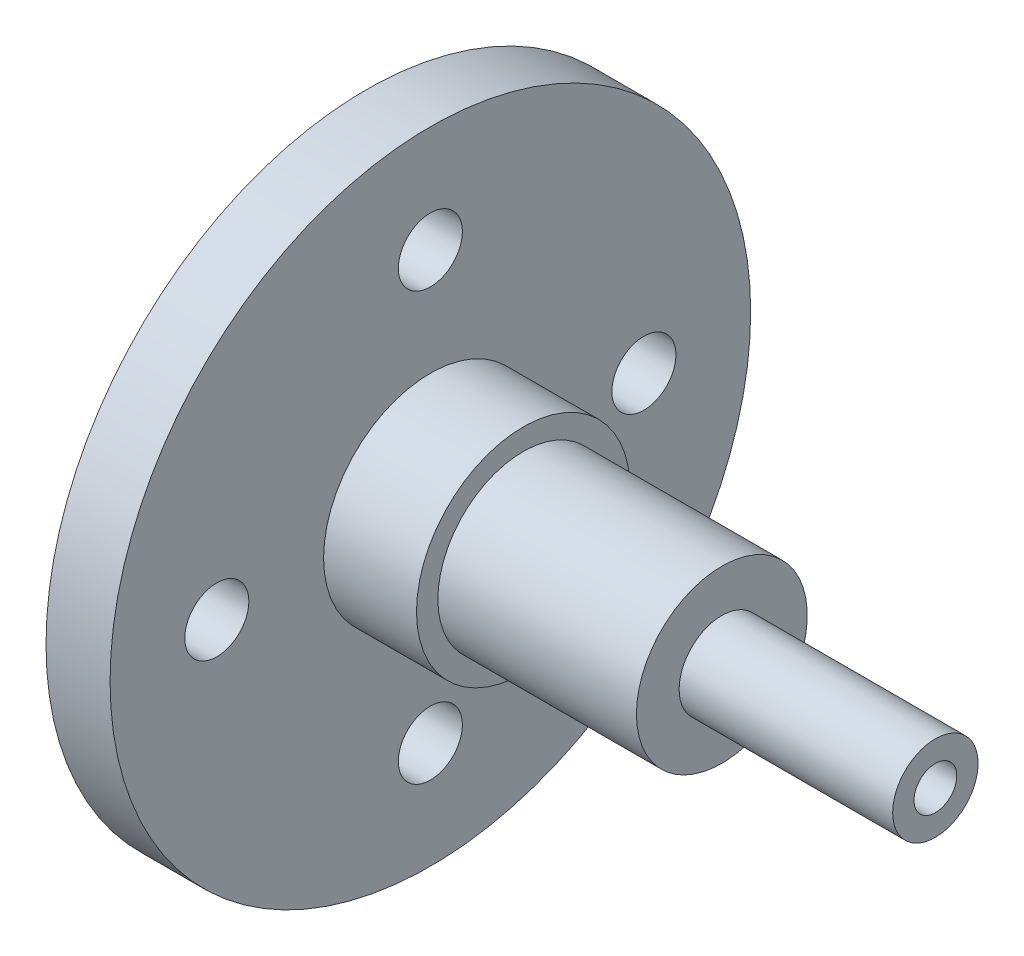
ISO-10303-21;
HEADER;
FILE_DESCRIPTION(('STEP AP214'),'2;1');
FILE_NAME('part.step','',(''),(''),'','','');
FILE_SCHEMA(('AUTOMOTIVE_DESIGN { 1 0 10303 214 1 1 1 1 }'));
ENDSEC;
DATA;
#1=APPLICATION_CONTEXT('core data for automotive mechanical design processes');
#2=APPLICATION_PROTOCOL_DEFINITION('international standard','automotive_design',2000,#1);
#3=PRODUCT_CONTEXT('',#1,'mechanical');
#4=PRODUCT('Part','Part','',(#3));
#5=PRODUCT_RELATED_PRODUCT_CATEGORY('part','',(#4));
#6=PRODUCT_DEFINITION_FORMATION('','',#4);
#7=PRODUCT_DEFINITION_CONTEXT('part definition',#1,'design');
#8=PRODUCT_DEFINITION('design','',#6,#7);
#9=PRODUCT_DEFINITION_SHAPE('','',#8);
#10=(LENGTH_UNIT() NAMED_UNIT(*) SI_UNIT(.MILLI.,.METRE.));
#11=(NAMED_UNIT(*) PLANE_ANGLE_UNIT() SI_UNIT($,.RADIAN.));
#12=(NAMED_UNIT(*) SI_UNIT($,.STERADIAN.) SOLID_ANGLE_UNIT());
#13=UNCERTAINTY_MEASURE_WITH_UNIT(LENGTH_MEASURE(1.E-05),#10,'distance_accuracy_value','');
#14=(GEOMETRIC_REPRESENTATION_CONTEXT(3) GLOBAL_UNCERTAINTY_ASSIGNED_CONTEXT((#13)) GLOBAL_UNIT_ASSIGNED_CONTEXT((#10,
#11,#12)) REPRESENTATION_CONTEXT('',''));
#15=CARTESIAN_POINT('',(0.,0.,0.));
#16=DIRECTION('',(0.,0.,1.));
#17=DIRECTION('',(1.,0.,0.));
#18=AXIS2_PLACEMENT_3D('',#15,#16,#17);
#19=CARTESIAN_POINT('',(-13.325,0.,0.));
#20=DIRECTION('',(-1.,0.,0.));
#21=DIRECTION('',(0.,0.,1.));
#22=AXIS2_PLACEMENT_3D('',#19,#20,#21);
#23=CYLINDRICAL_SURFACE('',#22,15.);
#24=CARTESIAN_POINT('',(-13.325,0.,0.));
#25=DIRECTION('',(-1.,0.,0.));
#26=DIRECTION('',(0.,0.,1.));
#27=AXIS2_PLACEMENT_3D('',#24,#25,#26);
#28=CIRCLE('',#27,15.);
#29=CARTESIAN_POINT('',(-13.325,0.,15.));
#30=VERTEX_POINT('',#29);
#31=EDGE_CURVE('E75',#30,#30,#28,.T.);
#32=ORIENTED_EDGE('',*,*,#31,.F.);
#33=EDGE_LOOP('',(#32));
#34=FACE_BOUND('',#33,.T.);
#35=CARTESIAN_POINT('',(-10.325,0.,0.));
#36=DIRECTION('',(-1.,0.,0.));
#37=DIRECTION('',(0.,0.,1.));
#38=AXIS2_PLACEMENT_3D('',#35,#36,#37);
#39=CIRCLE('',#38,15.);
#40=CARTESIAN_POINT('',(-10.325,0.,15.));
#41=VERTEX_POINT('',#40);
#42=EDGE_CURVE('E10',#41,#41,#39,.T.);
#43=ORIENTED_EDGE('',*,*,#42,.T.);
#44=EDGE_LOOP('',(#43));
#45=FACE_BOUND('',#44,.T.);
#46=ADVANCED_FACE('F41',(#34,#45),#23,.T.);
#47=CARTESIAN_POINT('',(-10.325,15.,0.));
#48=DIRECTION('',(-1.,0.,0.));
#49=DIRECTION('',(0.,0.,1.));
#50=AXIS2_PLACEMENT_3D('',#47,#48,#49);
#51=PLANE('',#50);
#52=CARTESIAN_POINT('',(-10.325,10.,0.));
#53=DIRECTION('',(1.,0.,0.));
#54=DIRECTION('',(0.,0.,-1.));
#55=AXIS2_PLACEMENT_3D('',#52,#53,#54);
#56=CIRCLE('',#55,1.5);
#57=CARTESIAN_POINT('',(-10.325,10.,-1.5));
#58=VERTEX_POINT('',#57);
#59=EDGE_CURVE('E97',#58,#58,#56,.T.);
#60=ORIENTED_EDGE('',*,*,#59,.F.);
#61=EDGE_LOOP('',(#60));
#62=FACE_BOUND('',#61,.T.);
#63=CARTESIAN_POINT('',(-10.325,0.,-10.));
#64=DIRECTION('',(1.,0.,0.));
#65=DIRECTION('',(0.,0.,-1.));
#66=AXIS2_PLACEMENT_3D('',#63,#64,#65);
#67=CIRCLE('',#66,1.5);
#68=CARTESIAN_POINT('',(-10.325,0.,-11.5));
#69=VERTEX_POINT('',#68);
#70=EDGE_CURVE('E94',#69,#69,#67,.T.);
#71=ORIENTED_EDGE('',*,*,#70,.F.);
#72=EDGE_LOOP('',(#71));
#73=FACE_BOUND('',#72,.T.);
#74=CARTESIAN_POINT('',(-10.325,-10.,0.));
#75=DIRECTION('',(1.,0.,0.));
#76=DIRECTION('',(0.,0.,-1.));
#77=AXIS2_PLACEMENT_3D('',#74,#75,#76);
#78=CIRCLE('',#77,1.5);
#79=CARTESIAN_POINT('',(-10.325,-10.,-1.49999999999993));
#80=VERTEX_POINT('',#79);
#81=EDGE_CURVE('E88',#80,#80,#78,.T.);
#82=ORIENTED_EDGE('',*,*,#81,.F.);
#83=EDGE_LOOP('',(#82));
#84=FACE_BOUND('',#83,.T.);
#85=CARTESIAN_POINT('',(-10.325,1.04744440165294E-13,10.));
#86=DIRECTION('',(1.,0.,0.));
#87=DIRECTION('',(0.,0.,-1.));
#88=AXIS2_PLACEMENT_3D('',#85,#86,#87);
#89=CIRCLE('',#88,1.5);
#90=CARTESIAN_POINT('',(-10.325,1.04744440165294E-13,8.5));
#91=VERTEX_POINT('',#90);
#92=EDGE_CURVE('E82',#91,#91,#89,.T.);
#93=ORIENTED_EDGE('',*,*,#92,.F.);
#94=EDGE_LOOP('',(#93));
#95=FACE_BOUND('',#94,.T.);
#96=ORIENTED_EDGE('',*,*,#42,.F.);
#97=EDGE_LOOP('',(#96));
#98=FACE_BOUND('',#97,.T.);
#99=CARTESIAN_POINT('',(-10.325,0.,0.));
#100=DIRECTION('',(-1.,0.,0.));
#101=DIRECTION('',(0.,0.,1.));
#102=AXIS2_PLACEMENT_3D('',#99,#100,#101);
#103=CIRCLE('',#102,5.);
#104=CARTESIAN_POINT('',(-10.325,0.,5.));
#105=VERTEX_POINT('',#104);
#106=EDGE_CURVE('E47',#105,#105,#103,.T.);
#107=ORIENTED_EDGE('',*,*,#106,.T.);
#108=EDGE_LOOP('',(#107));
#109=FACE_BOUND('',#108,.T.);
#110=ADVANCED_FACE('F113',(#62,#73,#84,#95,#98,#109),#51,.F.);
#111=CARTESIAN_POINT('',(-13.325,0.,0.));
#112=DIRECTION('',(-1.,0.,0.));
#113=DIRECTION('',(0.,0.,1.));
#114=AXIS2_PLACEMENT_3D('',#111,#112,#113);
#115=CYLINDRICAL_SURFACE('',#114,5.);
#116=ORIENTED_EDGE('',*,*,#106,.F.);
#117=EDGE_LOOP('',(#116));
#118=FACE_BOUND('',#117,.T.);
#119=CARTESIAN_POINT('',(-5.975,0.,0.));
#120=DIRECTION('',(-1.,0.,0.));
#121=DIRECTION('',(0.,0.,1.));
#122=AXIS2_PLACEMENT_3D('',#119,#120,#121);
#123=CIRCLE('',#122,5.);
#124=CARTESIAN_POINT('',(-5.975,0.,5.));
#125=VERTEX_POINT('',#124);
#126=EDGE_CURVE('E51',#125,#125,#123,.T.);
#127=ORIENTED_EDGE('',*,*,#126,.T.);
#128=EDGE_LOOP('',(#127));
#129=FACE_BOUND('',#128,.T.);
#130=ADVANCED_FACE('F116',(#118,#129),#115,.T.);
#131=CARTESIAN_POINT('',(-5.975,5.,0.));
#132=DIRECTION('',(-1.,0.,0.));
#133=DIRECTION('',(0.,0.,1.));
#134=AXIS2_PLACEMENT_3D('',#131,#132,#133);
#135=PLANE('',#134);
#136=ORIENTED_EDGE('',*,*,#126,.F.);
#137=EDGE_LOOP('',(#136));
#138=FACE_BOUND('',#137,.T.);
#139=CARTESIAN_POINT('',(-5.975,0.,0.));
#140=DIRECTION('',(-1.,0.,0.));
#141=DIRECTION('',(0.,0.,1.));
#142=AXIS2_PLACEMENT_3D('',#139,#140,#141);
#143=CIRCLE('',#142,4.);
#144=CARTESIAN_POINT('',(-5.975,0.,4.));
#145=VERTEX_POINT('',#144);
#146=EDGE_CURVE('E55',#145,#145,#143,.T.);
#147=ORIENTED_EDGE('',*,*,#146,.T.);
#148=EDGE_LOOP('',(#147));
#149=FACE_BOUND('',#148,.T.);
#150=ADVANCED_FACE('F152',(#138,#149),#135,.F.);
#151=CARTESIAN_POINT('',(-13.325,0.,0.));
#152=DIRECTION('',(-1.,0.,0.));
#153=DIRECTION('',(0.,0.,1.));
#154=AXIS2_PLACEMENT_3D('',#151,#152,#153);
#155=CYLINDRICAL_SURFACE('',#154,4.);
#156=ORIENTED_EDGE('',*,*,#146,.F.);
#157=EDGE_LOOP('',(#156));
#158=FACE_BOUND('',#157,.T.);
#159=CARTESIAN_POINT('',(3.325,0.,0.));
#160=DIRECTION('',(-1.,0.,0.));
#161=DIRECTION('',(0.,0.,1.));
#162=AXIS2_PLACEMENT_3D('',#159,#160,#161);
#163=CIRCLE('',#162,4.);
#164=CARTESIAN_POINT('',(3.325,0.,4.));
#165=VERTEX_POINT('',#164);
#166=EDGE_CURVE('E60',#165,#165,#163,.T.);
#167=ORIENTED_EDGE('',*,*,#166,.T.);
#168=EDGE_LOOP('',(#167));
#169=FACE_BOUND('',#168,.T.);
#170=ADVANCED_FACE('F161',(#158,#169),#155,.T.);
#171=CARTESIAN_POINT('',(3.325,4.,0.));
#172=DIRECTION('',(-1.,0.,0.));
#173=DIRECTION('',(0.,0.,1.));
#174=AXIS2_PLACEMENT_3D('',#171,#172,#173);
#175=PLANE('',#174);
#176=ORIENTED_EDGE('',*,*,#166,.F.);
#177=EDGE_LOOP('',(#176));
#178=FACE_BOUND('',#177,.T.);
#179=CARTESIAN_POINT('',(3.325,0.,0.));
#180=DIRECTION('',(-1.,0.,0.));
#181=DIRECTION('',(0.,0.,1.));
#182=AXIS2_PLACEMENT_3D('',#179,#180,#181);
#183=CIRCLE('',#182,2.);
#184=CARTESIAN_POINT('',(3.325,0.,2.));
#185=VERTEX_POINT('',#184);
#186=EDGE_CURVE('E63',#185,#185,#183,.T.);
#187=ORIENTED_EDGE('',*,*,#186,.T.);
#188=EDGE_LOOP('',(#187));
#189=FACE_BOUND('',#188,.T.);
#190=ADVANCED_FACE('F170',(#178,#189),#175,.F.);
#191=CARTESIAN_POINT('',(-13.325,0.,0.));
#192=DIRECTION('',(-1.,0.,0.));
#193=DIRECTION('',(0.,0.,1.));
#194=AXIS2_PLACEMENT_3D('',#191,#192,#193);
#195=CYLINDRICAL_SURFACE('',#194,2.);
#196=ORIENTED_EDGE('',*,*,#186,.F.);
#197=EDGE_LOOP('',(#196));
#198=FACE_BOUND('',#197,.T.);
#199=CARTESIAN_POINT('',(13.325,0.,0.));
#200=DIRECTION('',(-1.,0.,0.));
#201=DIRECTION('',(0.,0.,1.));
#202=AXIS2_PLACEMENT_3D('',#199,#200,#201);
#203=CIRCLE('',#202,2.);
#204=CARTESIAN_POINT('',(13.325,0.,2.));
#205=VERTEX_POINT('',#204);
#206=EDGE_CURVE('E66',#205,#205,#203,.T.);
#207=ORIENTED_EDGE('',*,*,#206,.T.);
#208=EDGE_LOOP('',(#207));
#209=FACE_BOUND('',#208,.T.);
#210=ADVANCED_FACE('F179',(#198,#209),#195,.T.);
#211=CARTESIAN_POINT('',(13.325,2.,0.));
#212=DIRECTION('',(-1.,0.,0.));
#213=DIRECTION('',(0.,0.,1.));
#214=AXIS2_PLACEMENT_3D('',#211,#212,#213);
#215=PLANE('',#214);
#216=ORIENTED_EDGE('',*,*,#206,.F.);
#217=EDGE_LOOP('',(#216));
#218=FACE_BOUND('',#217,.T.);
#219=CARTESIAN_POINT('',(13.325,0.,0.));
#220=DIRECTION('',(-1.,0.,0.));
#221=DIRECTION('',(0.,0.,1.));
#222=AXIS2_PLACEMENT_3D('',#219,#220,#221);
#223=CIRCLE('',#222,0.999999999999997);
#224=CARTESIAN_POINT('',(13.325,0.,0.999999999999997));
#225=VERTEX_POINT('',#224);
#226=EDGE_CURVE('E69',#225,#225,#223,.T.);
#227=ORIENTED_EDGE('',*,*,#226,.T.);
#228=EDGE_LOOP('',(#227));
#229=FACE_BOUND('',#228,.T.);
#230=ADVANCED_FACE('F188',(#218,#229),#215,.F.);
#231=CARTESIAN_POINT('',(-13.325,0.,0.));
#232=DIRECTION('',(-1.,0.,0.));
#233=DIRECTION('',(0.,0.,1.));
#234=AXIS2_PLACEMENT_3D('',#231,#232,#233);
#235=CYLINDRICAL_SURFACE('',#234,0.999999999999997);
#236=ORIENTED_EDGE('',*,*,#226,.F.);
#237=EDGE_LOOP('',(#236));
#238=FACE_BOUND('',#237,.T.);
#239=CARTESIAN_POINT('',(-13.325,0.,0.));
#240=DIRECTION('',(-1.,0.,0.));
#241=DIRECTION('',(0.,0.,1.));
#242=AXIS2_PLACEMENT_3D('',#239,#240,#241);
#243=CIRCLE('',#242,0.999999999999997);
#244=CARTESIAN_POINT('',(-13.325,0.,0.999999999999997));
#245=VERTEX_POINT('',#244);
#246=EDGE_CURVE('E72',#245,#245,#243,.T.);
#247=ORIENTED_EDGE('',*,*,#246,.T.);
#248=EDGE_LOOP('',(#247));
#249=FACE_BOUND('',#248,.T.);
#250=ADVANCED_FACE('F135',(#238,#249),#235,.F.);
#251=CARTESIAN_POINT('',(-13.325,0.999999999999997,0.));
#252=DIRECTION('',(1.,0.,0.));
#253=DIRECTION('',(0.,0.,-1.));
#254=AXIS2_PLACEMENT_3D('',#251,#252,#253);
#255=PLANE('',#254);
#256=CARTESIAN_POINT('',(-13.325,10.,0.));
#257=DIRECTION('',(1.,0.,0.));
#258=DIRECTION('',(0.,0.,-1.));
#259=AXIS2_PLACEMENT_3D('',#256,#257,#258);
#260=CIRCLE('',#259,1.5);
#261=CARTESIAN_POINT('',(-13.325,10.,-1.5));
#262=VERTEX_POINT('',#261);
#263=EDGE_CURVE('E78',#262,#262,#260,.T.);
#264=ORIENTED_EDGE('',*,*,#263,.T.);
#265=EDGE_LOOP('',(#264));
#266=FACE_BOUND('',#265,.T.);
#267=CARTESIAN_POINT('',(-13.325,0.,-10.));
#268=DIRECTION('',(1.,0.,0.));
#269=DIRECTION('',(0.,0.,-1.));
#270=AXIS2_PLACEMENT_3D('',#267,#268,#269);
#271=CIRCLE('',#270,1.5);
#272=CARTESIAN_POINT('',(-13.325,0.,-11.5));
#273=VERTEX_POINT('',#272);
#274=EDGE_CURVE('E91',#273,#273,#271,.T.);
#275=ORIENTED_EDGE('',*,*,#274,.T.);
#276=EDGE_LOOP('',(#275));
#277=FACE_BOUND('',#276,.T.);
#278=CARTESIAN_POINT('',(-13.325,-10.,0.));
#279=DIRECTION('',(1.,0.,0.));
#280=DIRECTION('',(0.,0.,-1.));
#281=AXIS2_PLACEMENT_3D('',#278,#279,#280);
#282=CIRCLE('',#281,1.5);
#283=CARTESIAN_POINT('',(-13.325,-10.,-1.49999999999993));
#284=VERTEX_POINT('',#283);
#285=EDGE_CURVE('E85',#284,#284,#282,.T.);
#286=ORIENTED_EDGE('',*,*,#285,.T.);
#287=EDGE_LOOP('',(#286));
#288=FACE_BOUND('',#287,.T.);
#289=CARTESIAN_POINT('',(-13.325,1.04744440165294E-13,10.));
#290=DIRECTION('',(1.,0.,0.));
#291=DIRECTION('',(0.,0.,-1.));
#292=AXIS2_PLACEMENT_3D('',#289,#290,#291);
#293=CIRCLE('',#292,1.5);
#294=CARTESIAN_POINT('',(-13.325,1.04744440165294E-13,8.5));
#295=VERTEX_POINT('',#294);
#296=EDGE_CURVE('E79',#295,#295,#293,.T.);
#297=ORIENTED_EDGE('',*,*,#296,.T.);
#298=EDGE_LOOP('',(#297));
#299=FACE_BOUND('',#298,.T.);
#300=ORIENTED_EDGE('',*,*,#246,.F.);
#301=EDGE_LOOP('',(#300));
#302=FACE_BOUND('',#301,.T.);
#303=ORIENTED_EDGE('',*,*,#31,.T.);
#304=EDGE_LOOP('',(#303));
#305=FACE_BOUND('',#304,.T.);
#306=ADVANCED_FACE('F103',(#266,#277,#288,#299,#302,#305),#255,.F.);
#307=CARTESIAN_POINT('',(-13.325,1.04744440165294E-13,10.));
#308=DIRECTION('',(1.,0.,0.));
#309=DIRECTION('',(0.,0.,-1.));
#310=AXIS2_PLACEMENT_3D('',#307,#308,#309);
#311=CYLINDRICAL_SURFACE('',#310,1.5);
#312=ORIENTED_EDGE('',*,*,#296,.F.);
#313=EDGE_LOOP('',(#312));
#314=FACE_BOUND('',#313,.T.);
#315=ORIENTED_EDGE('',*,*,#92,.T.);
#316=EDGE_LOOP('',(#315));
#317=FACE_BOUND('',#316,.T.);
#318=ADVANCED_FACE('F124',(#314,#317),#311,.F.);
#319=CARTESIAN_POINT('',(-13.325,-10.,0.));
#320=DIRECTION('',(1.,0.,0.));
#321=DIRECTION('',(0.,0.,-1.));
#322=AXIS2_PLACEMENT_3D('',#319,#320,#321);
#323=CYLINDRICAL_SURFACE('',#322,1.5);
#324=ORIENTED_EDGE('',*,*,#285,.F.);
#325=EDGE_LOOP('',(#324));
#326=FACE_BOUND('',#325,.T.);
#327=ORIENTED_EDGE('',*,*,#81,.T.);
#328=EDGE_LOOP('',(#327));
#329=FACE_BOUND('',#328,.T.);
#330=ADVANCED_FACE('F126',(#326,#329),#323,.F.);
#331=CARTESIAN_POINT('',(-13.325,0.,-10.));
#332=DIRECTION('',(1.,0.,0.));
#333=DIRECTION('',(0.,0.,-1.));
#334=AXIS2_PLACEMENT_3D('',#331,#332,#333);
#335=CYLINDRICAL_SURFACE('',#334,1.5);
#336=ORIENTED_EDGE('',*,*,#274,.F.);
#337=EDGE_LOOP('',(#336));
#338=FACE_BOUND('',#337,.T.);
#339=ORIENTED_EDGE('',*,*,#70,.T.);
#340=EDGE_LOOP('',(#339));
#341=FACE_BOUND('',#340,.T.);
#342=ADVANCED_FACE('F109',(#338,#341),#335,.F.);
#343=CARTESIAN_POINT('',(-13.325,10.,0.));
#344=DIRECTION('',(1.,0.,0.));
#345=DIRECTION('',(0.,0.,-1.));
#346=AXIS2_PLACEMENT_3D('',#343,#344,#345);
#347=CYLINDRICAL_SURFACE('',#346,1.5);
#348=ORIENTED_EDGE('',*,*,#263,.F.);
#349=EDGE_LOOP('',(#348));
#350=FACE_BOUND('',#349,.T.);
#351=ORIENTED_EDGE('',*,*,#59,.T.);
#352=EDGE_LOOP('',(#351));
#353=FACE_BOUND('',#352,.T.);
#354=ADVANCED_FACE('F106',(#350,#353),#347,.F.);
#355=CLOSED_SHELL('',(#46,#110,#130,#150,#170,#190,#210,#230,#250,#306,#318,#330,#342,#354));
#356=MANIFOLD_SOLID_BREP('B2',#355);
#357=ADVANCED_BREP_SHAPE_REPRESENTATION('',(#18,#356),#14);
#358=SHAPE_DEFINITION_REPRESENTATION(#9,#357);
ENDSEC;
END-ISO-10303-21;
